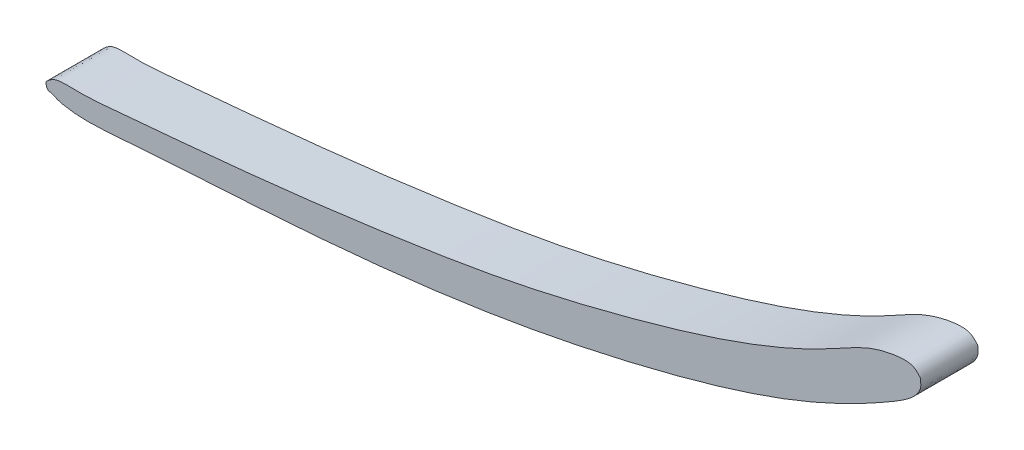
ISO-10303-21;
HEADER;
FILE_DESCRIPTION(('STEP AP214'),'2;1');
FILE_NAME('part.step','',(''),(''),'','','');
FILE_SCHEMA(('AUTOMOTIVE_DESIGN { 1 0 10303 214 1 1 1 1 }'));
ENDSEC;
DATA;
#1=APPLICATION_CONTEXT('core data for automotive mechanical design processes');
#2=APPLICATION_PROTOCOL_DEFINITION('international standard','automotive_design',2000,#1);
#3=PRODUCT_CONTEXT('',#1,'mechanical');
#4=PRODUCT('Part','Part','',(#3));
#5=PRODUCT_RELATED_PRODUCT_CATEGORY('part','',(#4));
#6=PRODUCT_DEFINITION_FORMATION('','',#4);
#7=PRODUCT_DEFINITION_CONTEXT('part definition',#1,'design');
#8=PRODUCT_DEFINITION('design','',#6,#7);
#9=PRODUCT_DEFINITION_SHAPE('','',#8);
#10=(LENGTH_UNIT() NAMED_UNIT(*) SI_UNIT(.MILLI.,.METRE.));
#11=(NAMED_UNIT(*) PLANE_ANGLE_UNIT() SI_UNIT($,.RADIAN.));
#12=(NAMED_UNIT(*) SI_UNIT($,.STERADIAN.) SOLID_ANGLE_UNIT());
#13=UNCERTAINTY_MEASURE_WITH_UNIT(LENGTH_MEASURE(1.E-05),#10,'distance_accuracy_value','');
#14=(GEOMETRIC_REPRESENTATION_CONTEXT(3) GLOBAL_UNCERTAINTY_ASSIGNED_CONTEXT((#13)) GLOBAL_UNIT_ASSIGNED_CONTEXT((#10,
#11,#12)) REPRESENTATION_CONTEXT('',''));
#15=CARTESIAN_POINT('',(0.,0.,0.));
#16=DIRECTION('',(0.,0.,1.));
#17=DIRECTION('',(1.,0.,0.));
#18=AXIS2_PLACEMENT_3D('',#15,#16,#17);
#19=CARTESIAN_POINT('',(69.8402019402488,0.,372.));
#20=CARTESIAN_POINT('',(69.8131183352634,0.080300507294765,372.));
#21=CARTESIAN_POINT('',(69.7587712007698,0.14502753566454,372.));
#22=CARTESIAN_POINT('',(69.6449684973582,0.267430118705679,372.));
#23=CARTESIAN_POINT('',(69.5845235550118,0.325095734601161,372.));
#24=CARTESIAN_POINT('',(69.4063527747583,0.501249561812645,372.));
#25=CARTESIAN_POINT('',(69.2884288249774,0.620944340683543,372.));
#26=CARTESIAN_POINT('',(69.0947803116933,0.777337881780583,372.));
#27=CARTESIAN_POINT('',(69.0279412314339,0.826034623100665,372.));
#28=CARTESIAN_POINT('',(68.885839439879,0.910792382153095,372.));
#29=CARTESIAN_POINT('',(68.8103310942326,0.947178860380819,372.));
#30=CARTESIAN_POINT('',(68.5754634481099,1.03931851645052,372.));
#31=CARTESIAN_POINT('',(68.4137254922421,1.0763337319631,372.));
#32=CARTESIAN_POINT('',(68.0851713294996,1.12633747270834,372.));
#33=CARTESIAN_POINT('',(67.9176648473177,1.13875837223819,372.));
#34=CARTESIAN_POINT('',(67.5855664422203,1.15038051347045,372.));
#35=CARTESIAN_POINT('',(67.4201268456446,1.14951689845259,372.));
#36=CARTESIAN_POINT('',(66.925437556886,1.12908435370032,372.));
#37=CARTESIAN_POINT('',(66.5977148238355,1.09279647330412,372.));
#38=CARTESIAN_POINT('',(65.6174580354396,0.952055271191534,372.));
#39=CARTESIAN_POINT('',(64.9665298261054,0.810778749377814,372.));
#40=CARTESIAN_POINT('',(63.699457151331,0.461916100979802,372.));
#41=CARTESIAN_POINT('',(63.0801898363106,0.251491643541852,372.));
#42=CARTESIAN_POINT('',(61.2643318804688,-0.485584043304456,372.));
#43=CARTESIAN_POINT('',(60.1061225212202,-1.11002705511773,372.));
#44=CARTESIAN_POINT('',(58.3777042398735,-2.06569067964736,372.));
#45=CARTESIAN_POINT('',(57.8027236866978,-2.38671390611819,372.));
#46=CARTESIAN_POINT('',(56.6465632189909,-3.01555420296361,372.));
#47=CARTESIAN_POINT('',(56.0660498147357,-3.32479110325924,372.));
#48=CARTESIAN_POINT('',(54.3109499964716,-4.22361652765636,372.));
#49=CARTESIAN_POINT('',(53.1224624814394,-4.78359230626769,372.));
#50=CARTESIAN_POINT('',(50.7204533074126,-5.85021501331587,372.));
#51=CARTESIAN_POINT('',(49.5071554857498,-6.35733877002181,372.));
#52=CARTESIAN_POINT('',(47.0624323073827,-7.33297019966831,372.));
#53=CARTESIAN_POINT('',(45.8303270261746,-7.80104830723811,372.));
#54=CARTESIAN_POINT('',(43.3527483815004,-8.69506402833173,372.));
#55=CARTESIAN_POINT('',(42.1068920479179,-9.12184143594133,372.));
#56=CARTESIAN_POINT('',(38.3525823638613,-10.3542507683054,372.));
#57=CARTESIAN_POINT('',(35.8301037057006,-11.1135759368345,372.));
#58=CARTESIAN_POINT('',(30.765716943693,-12.5585936633915,372.));
#59=CARTESIAN_POINT('',(28.2222435592048,-13.242517485026,372.));
#60=CARTESIAN_POINT('',(23.1173331987262,-14.5437801990008,372.));
#61=CARTESIAN_POINT('',(20.5575517741789,-15.1624264258865,372.));
#62=CARTESIAN_POINT('',(15.4185431667218,-16.3148220232327,372.));
#63=CARTESIAN_POINT('',(12.8379246034658,-16.8463987211125,372.));
#64=CARTESIAN_POINT('',(7.66005496765677,-17.8157610037317,372.));
#65=CARTESIAN_POINT('',(5.06336245636554,-18.2545124644928,372.));
#66=CARTESIAN_POINT('',(-0.139768865674681,-19.0743120973813,372.));
#67=CARTESIAN_POINT('',(-2.74617442692079,-19.456570614809,372.));
#68=CARTESIAN_POINT('',(-7.96301664283356,-20.1875345590055,372.));
#69=CARTESIAN_POINT('',(-10.5737379218002,-20.5358511703173,372.));
#70=CARTESIAN_POINT('',(-15.8006700814905,-21.1915174412162,372.));
#71=CARTESIAN_POINT('',(-18.4170916613073,-21.4970035664799,372.));
#72=CARTESIAN_POINT('',(-26.2724631411925,-22.3504742852798,372.));
#73=CARTESIAN_POINT('',(-31.5179520251604,-22.8392374694309,372.));
#74=CARTESIAN_POINT('',(-38.0752638111358,-23.4426019499776,372.));
#75=CARTESIAN_POINT('',(-39.3868088752837,-23.5623902665889,372.));
#76=CARTESIAN_POINT('',(-41.3545838944534,-23.73695713087,372.));
#77=CARTESIAN_POINT('',(-42.0106363500186,-23.7936758044754,372.));
#78=CARTESIAN_POINT('',(-43.3228017707354,-23.9064151000562,372.));
#79=CARTESIAN_POINT('',(-43.9788106514718,-23.9642402405613,372.));
#80=CARTESIAN_POINT('',(-45.2915385203457,-24.0682501968463,372.));
#81=CARTESIAN_POINT('',(-45.9482055429126,-24.1149922359368,372.));
#82=CARTESIAN_POINT('',(-47.2639169864788,-24.1671942518511,372.));
#83=CARTESIAN_POINT('',(-47.9231097510304,-24.1740214328811,372.));
#84=CARTESIAN_POINT('',(-48.911193653579,-24.1518494658561,372.));
#85=CARTESIAN_POINT('',(-49.2405322625955,-24.1406405673868,372.));
#86=CARTESIAN_POINT('',(-49.8993579363798,-24.1432026873211,372.));
#87=CARTESIAN_POINT('',(-50.2295908744075,-24.154110435112,372.));
#88=CARTESIAN_POINT('',(-50.8820139368018,-24.2383285267346,372.));
#89=CARTESIAN_POINT('',(-51.2062956798879,-24.3159306125897,372.));
#90=CARTESIAN_POINT('',(-51.6414534292673,-24.5388968970601,372.));
#91=CARTESIAN_POINT('',(-51.7799037771146,-24.6306236140924,372.));
#92=CARTESIAN_POINT('',(-51.9799905011985,-24.7768300271365,372.));
#93=CARTESIAN_POINT('',(-52.0451299301477,-24.8276274551133,372.));
#94=CARTESIAN_POINT('',(-52.1736630105728,-24.9315355378493,372.));
#95=CARTESIAN_POINT('',(-52.2396193353514,-24.9816911542746,372.));
#96=CARTESIAN_POINT('',(-52.3296853753061,-25.0667639562038,372.));
#97=CARTESIAN_POINT('',(-52.3578283731268,-25.0978198227402,372.));
#98=CARTESIAN_POINT('',(-52.4021530886467,-25.1667885442898,372.));
#99=CARTESIAN_POINT('',(-52.4187253518606,-25.2055027435144,372.));
#100=CARTESIAN_POINT('',(-52.4510235093626,-25.324644729202,372.));
#101=CARTESIAN_POINT('',(-52.447884634295,-25.4090863254408,372.));
#102=CARTESIAN_POINT('',(-52.4240087835658,-25.530102004863,372.));
#103=CARTESIAN_POINT('',(-52.413546911168,-25.5700760884489,372.));
#104=CARTESIAN_POINT('',(-52.3930659694707,-25.6498269760946,372.));
#105=CARTESIAN_POINT('',(-52.3829964252059,-25.6897610307274,372.));
#106=CARTESIAN_POINT('',(-52.3486458921998,-25.8081429350008,372.));
#107=CARTESIAN_POINT('',(-52.3215806277977,-25.8865812588097,372.));
#108=CARTESIAN_POINT('',(-52.2495180146907,-25.990494912569,372.));
#109=CARTESIAN_POINT('',(-52.2210913473094,-26.0211756240109,372.));
#110=CARTESIAN_POINT('',(-52.152489740778,-26.0712194628641,372.));
#111=CARTESIAN_POINT('',(-52.1150314450859,-26.0898211789263,372.));
#112=CARTESIAN_POINT('',(-51.9981447267867,-26.1364523149267,372.));
#113=CARTESIAN_POINT('',(-51.915111938896,-26.1549932060413,372.));
#114=CARTESIAN_POINT('',(-51.6719180110431,-26.2245497753252,372.));
#115=CARTESIAN_POINT('',(-51.5160063509078,-26.2909312526393,372.));
#116=CARTESIAN_POINT('',(-51.2036600658016,-26.4204933929851,372.));
#117=CARTESIAN_POINT('',(-51.047629714395,-26.485677059197,372.));
#118=CARTESIAN_POINT('',(-50.7295513330745,-26.5990776987286,372.));
#119=CARTESIAN_POINT('',(-50.5677226760638,-26.6479131884204,372.));
#120=CARTESIAN_POINT('',(-50.0762555548555,-26.7775559553132,372.));
#121=CARTESIAN_POINT('',(-49.7446150835881,-26.8416383793035,372.));
#122=CARTESIAN_POINT('',(-48.7503259548034,-27.0019394730627,372.));
#123=CARTESIAN_POINT('',(-48.0838100295354,-27.06158219846,372.));
#124=CARTESIAN_POINT('',(-46.7452101481155,-27.1089551683538,372.));
#125=CARTESIAN_POINT('',(-46.0728741226985,-27.0983424292826,372.));
#126=CARTESIAN_POINT('',(-44.727712795404,-27.0492937253493,372.));
#127=CARTESIAN_POINT('',(-44.0560842297511,-27.009665138969,372.));
#128=CARTESIAN_POINT('',(-42.7135081655366,-26.9196034092638,372.));
#129=CARTESIAN_POINT('',(-42.0425270111156,-26.8697041878575,372.));
#130=CARTESIAN_POINT('',(-40.0297721072127,-26.7170151878833,372.));
#131=CARTESIAN_POINT('',(-38.6879140632857,-26.6154772782522,372.));
#132=CARTESIAN_POINT('',(-34.6608707490514,-26.3323852606477,372.));
#133=CARTESIAN_POINT('',(-31.9744422180334,-26.1689376297405,372.));
#134=CARTESIAN_POINT('',(-26.6013311774076,-25.8458070128437,372.));
#135=CARTESIAN_POINT('',(-23.9149016801755,-25.6823897521334,372.));
#136=CARTESIAN_POINT('',(-18.5445964647633,-25.3180265743581,372.));
#137=CARTESIAN_POINT('',(-15.8605953389578,-25.1186983259998,372.));
#138=CARTESIAN_POINT('',(-10.4963970269348,-24.6650471858788,372.));
#139=CARTESIAN_POINT('',(-7.81728173968948,-24.4112920370014,372.));
#140=CARTESIAN_POINT('',(-2.46592570597572,-23.8417386327325,372.));
#141=CARTESIAN_POINT('',(0.206175072227283,-23.5246771560897,372.));
#142=CARTESIAN_POINT('',(5.54236516760205,-22.8182503288115,372.));
#143=CARTESIAN_POINT('',(8.20632993560297,-22.4291919592873,372.));
#144=CARTESIAN_POINT('',(13.5177598929493,-21.5666546679563,372.));
#145=CARTESIAN_POINT('',(16.1661107492414,-21.0937088683825,372.));
#146=CARTESIAN_POINT('',(21.4480940565549,-20.0645186478921,372.));
#147=CARTESIAN_POINT('',(24.0823644014661,-19.5080989791813,372.));
#148=CARTESIAN_POINT('',(29.3326227369891,-18.3191204480519,372.));
#149=CARTESIAN_POINT('',(31.9494412793529,-17.685802147735,372.));
#150=CARTESIAN_POINT('',(37.1599370089087,-16.3349579722053,372.));
#151=CARTESIAN_POINT('',(39.7533249942604,-15.6177129516509,372.));
#152=CARTESIAN_POINT('',(44.9054062956812,-14.0608748857915,372.));
#153=CARTESIAN_POINT('',(47.4651678115336,-13.2209291792075,372.));
#154=CARTESIAN_POINT('',(52.5136374524997,-11.3573095555039,372.));
#155=CARTESIAN_POINT('',(55.0056033621111,-10.3306348557027,372.));
#156=CARTESIAN_POINT('',(59.8873854609712,-8.06098425834151,372.));
#157=CARTESIAN_POINT('',(62.2788506940096,-6.81731507055602,372.));
#158=CARTESIAN_POINT('',(65.2098232422236,-5.16204542117804,372.));
#159=CARTESIAN_POINT('',(65.7934119812579,-4.82598129471765,372.));
#160=CARTESIAN_POINT('',(66.6575410335251,-4.30360562560369,372.));
#161=CARTESIAN_POINT('',(66.9432968359591,-4.12584278691391,372.));
#162=CARTESIAN_POINT('',(67.506449396512,-3.75702277970958,372.));
#163=CARTESIAN_POINT('',(67.7846696662486,-3.56639257817494,372.));
#164=CARTESIAN_POINT('',(68.3208293281332,-3.16278690060663,372.));
#165=CARTESIAN_POINT('',(68.578929880837,-2.94943343556422,372.));
#166=CARTESIAN_POINT('',(69.0609309634175,-2.48314130981117,372.));
#167=CARTESIAN_POINT('',(69.2858186324726,-2.22599134991544,372.));
#168=CARTESIAN_POINT('',(69.5673479713734,-1.80581731255984,372.));
#169=CARTESIAN_POINT('',(69.6528583031837,-1.66011621512446,372.));
#170=CARTESIAN_POINT('',(69.7932910116592,-1.34986940220384,372.));
#171=CARTESIAN_POINT('',(69.8465669804037,-1.19042625663442,372.));
#172=CARTESIAN_POINT('',(69.8931160961482,-0.856239455606819,372.));
#173=CARTESIAN_POINT('',(69.8814829828615,-0.682635224578085,372.));
#174=CARTESIAN_POINT('',(69.8662400925738,-0.426635516309508,372.));
#175=CARTESIAN_POINT('',(69.8647291434248,-0.341129431465914,372.));
#176=CARTESIAN_POINT('',(69.8644848831091,-0.212772397470078,372.));
#177=CARTESIAN_POINT('',(69.8648048805396,-0.169967284109232,372.));
#178=CARTESIAN_POINT('',(69.859865027392,-0.0846272159079974,372.));
#179=CARTESIAN_POINT('',(69.8537437427416,-0.0401502536473772,372.));
#180=CARTESIAN_POINT('',(69.8402019402488,0.,372.));
#181=B_SPLINE_CURVE_WITH_KNOTS('',3,(#19,#20,#21,#22,#23,#24,#25,#26,#27,#28,#29,#30,#31,#32,
#33,#34,#35,#36,#37,#38,#39,#40,#41,#42,#43,#44,#45,#46,#47,#48,#49,#50,#51,#52,#53,#54,#55,#56,
#57,#58,#59,#60,#61,#62,#63,#64,#65,#66,#67,#68,#69,#70,#71,#72,#73,#74,#75,#76,#77,#78,#79,#80,
#81,#82,#83,#84,#85,#86,#87,#88,#89,#90,#91,#92,#93,#94,#95,#96,#97,#98,#99,#100,#101,#102,#103,
#104,#105,#106,#107,#108,#109,#110,#111,#112,#113,#114,#115,#116,#117,#118,#119,#120,#121,#122,
#123,#124,#125,#126,#127,#128,#129,#130,#131,#132,#133,#134,#135,#136,#137,#138,#139,#140,#141,
#142,#143,#144,#145,#146,#147,#148,#149,#150,#151,#152,#153,#154,#155,#156,#157,#158,#159,#160,
#161,#162,#163,#164,#165,#166,#167,#168,#169,#170,#171,#172,#173,#174,#175,#176,#177,#178,#179,
#180),.UNSPECIFIED.,.T.,.F.,(4,2,2,2,2,2,2,2,2,2,2,2,2,2,2,2,2,2,2,2,2,2,2,2,2,2,2,2,2,2,2,2,2,
2,2,2,2,2,2,2,2,2,2,2,2,2,2,2,2,2,2,2,2,2,2,2,2,2,2,2,2,2,2,2,2,2,2,2,2,2,2,2,2,2,2,2,2,2,2,2,
4),(0.,0.000976562500000015,0.00195312500000003,0.00390625000000018,0.00488281250000025,
0.00585937500000032,0.00781250000000032,0.00976562500000031,0.0117187500000003,
0.0156250000000001,0.0234374999999998,0.0312499999999995,0.0468749999999988,0.0546874999999985,
0.0624999999999982,0.0781249999999975,0.0937499999999968,0.109374999999996,0.124999999999996,
0.156249999999994,0.187499999999993,0.218749999999991,0.24999999999999,0.281249999999988,
0.312499999999987,0.343749999999985,0.374999999999984,0.437499999999981,0.45312499999998,
0.46093749999998,0.46874999999998,0.476562499999979,0.484374999999979,0.488281249999979,
0.492187499999979,0.496093749999978,0.498046874999978,0.499023437499978,0.499999999999978,
0.500488281249978,0.500976562499978,0.501953124999978,0.502441406249978,0.502929687499978,
0.503906249999978,0.504394531249978,0.504882812499978,0.505859374999978,0.507812499999979,
0.509765624999979,0.511718749999979,0.515624999999979,0.523437499999979,0.53124999999998,
0.53906249999998,0.54687499999998,0.562499999999981,0.593749999999982,0.624999999999984,
0.656249999999985,0.687499999999987,0.718749999999988,0.749999999999989,0.781249999999991,
0.812499999999992,0.843749999999993,0.874999999999995,0.906249999999996,0.937499999999998,
0.968749999999999,0.976562499999999,0.980468749999999,0.984375,0.98828125,0.9921875,0.994140625,
0.99609375,0.998046875,0.9990234375,0.99951171875,1.),.UNSPECIFIED.);
#182=DIRECTION('',(0.,0.,-1.));
#183=VECTOR('',#182,1.);
#184=SURFACE_OF_LINEAR_EXTRUSION('',#181,#183);
#185=CARTESIAN_POINT('',(69.8402019402488,0.,372.));
#186=CARTESIAN_POINT('',(69.8537437427416,-0.0401502536473772,372.));
#187=CARTESIAN_POINT('',(69.859865027392,-0.0846272159079974,372.));
#188=CARTESIAN_POINT('',(69.8648048805396,-0.169967284109232,372.));
#189=CARTESIAN_POINT('',(69.8644848831091,-0.212772397470078,372.));
#190=CARTESIAN_POINT('',(69.8647291434248,-0.341129431465914,372.));
#191=CARTESIAN_POINT('',(69.8662400925738,-0.426635516309508,372.));
#192=CARTESIAN_POINT('',(69.8814829828615,-0.682635224578085,372.));
#193=CARTESIAN_POINT('',(69.8931160961482,-0.856239455606819,372.));
#194=CARTESIAN_POINT('',(69.8465669804037,-1.19042625663442,372.));
#195=CARTESIAN_POINT('',(69.7932910116592,-1.34986940220384,372.));
#196=CARTESIAN_POINT('',(69.6528583031837,-1.66011621512446,372.));
#197=CARTESIAN_POINT('',(69.5673479713734,-1.80581731255984,372.));
#198=CARTESIAN_POINT('',(69.2858186324726,-2.22599134991544,372.));
#199=CARTESIAN_POINT('',(69.0609309634175,-2.48314130981117,372.));
#200=CARTESIAN_POINT('',(68.578929880837,-2.94943343556422,372.));
#201=CARTESIAN_POINT('',(68.3208293281332,-3.16278690060663,372.));
#202=CARTESIAN_POINT('',(67.7846696662486,-3.56639257817494,372.));
#203=CARTESIAN_POINT('',(67.506449396512,-3.75702277970958,372.));
#204=CARTESIAN_POINT('',(66.9432968359591,-4.12584278691391,372.));
#205=CARTESIAN_POINT('',(66.6575410335251,-4.30360562560369,372.));
#206=CARTESIAN_POINT('',(65.7934119812579,-4.82598129471765,372.));
#207=CARTESIAN_POINT('',(65.2098232422236,-5.16204542117804,372.));
#208=CARTESIAN_POINT('',(62.2788506940096,-6.81731507055602,372.));
#209=CARTESIAN_POINT('',(59.8873854609712,-8.06098425834151,372.));
#210=CARTESIAN_POINT('',(55.0056033621111,-10.3306348557027,372.));
#211=CARTESIAN_POINT('',(52.5136374524997,-11.3573095555039,372.));
#212=CARTESIAN_POINT('',(47.4651678115336,-13.2209291792075,372.));
#213=CARTESIAN_POINT('',(44.9054062956812,-14.0608748857915,372.));
#214=CARTESIAN_POINT('',(39.7533249942604,-15.6177129516509,372.));
#215=CARTESIAN_POINT('',(37.1599370089087,-16.3349579722053,372.));
#216=CARTESIAN_POINT('',(31.9494412793529,-17.685802147735,372.));
#217=CARTESIAN_POINT('',(29.3326227369891,-18.3191204480519,372.));
#218=CARTESIAN_POINT('',(24.0823644014661,-19.5080989791813,372.));
#219=CARTESIAN_POINT('',(21.4480940565549,-20.0645186478921,372.));
#220=CARTESIAN_POINT('',(16.1661107492414,-21.0937088683825,372.));
#221=CARTESIAN_POINT('',(13.5177598929493,-21.5666546679563,372.));
#222=CARTESIAN_POINT('',(8.20632993560297,-22.4291919592873,372.));
#223=CARTESIAN_POINT('',(5.54236516760205,-22.8182503288115,372.));
#224=CARTESIAN_POINT('',(0.206175072227283,-23.5246771560897,372.));
#225=CARTESIAN_POINT('',(-2.46592570597572,-23.8417386327325,372.));
#226=CARTESIAN_POINT('',(-7.81728173968948,-24.4112920370014,372.));
#227=CARTESIAN_POINT('',(-10.4963970269348,-24.6650471858788,372.));
#228=CARTESIAN_POINT('',(-15.8605953389578,-25.1186983259998,372.));
#229=CARTESIAN_POINT('',(-18.5445964647633,-25.3180265743581,372.));
#230=CARTESIAN_POINT('',(-23.9149016801755,-25.6823897521334,372.));
#231=CARTESIAN_POINT('',(-26.6013311774076,-25.8458070128437,372.));
#232=CARTESIAN_POINT('',(-31.9744422180334,-26.1689376297405,372.));
#233=CARTESIAN_POINT('',(-34.6608707490514,-26.3323852606477,372.));
#234=CARTESIAN_POINT('',(-38.6879140632857,-26.6154772782522,372.));
#235=CARTESIAN_POINT('',(-40.0297721072127,-26.7170151878833,372.));
#236=CARTESIAN_POINT('',(-42.0425270111156,-26.8697041878575,372.));
#237=CARTESIAN_POINT('',(-42.7135081655366,-26.9196034092638,372.));
#238=CARTESIAN_POINT('',(-44.0560842297511,-27.009665138969,372.));
#239=CARTESIAN_POINT('',(-44.727712795404,-27.0492937253493,372.));
#240=CARTESIAN_POINT('',(-46.0728741226985,-27.0983424292826,372.));
#241=CARTESIAN_POINT('',(-46.7452101481155,-27.1089551683538,372.));
#242=CARTESIAN_POINT('',(-48.0838100295354,-27.06158219846,372.));
#243=CARTESIAN_POINT('',(-48.7503259548034,-27.0019394730627,372.));
#244=CARTESIAN_POINT('',(-49.7446150835881,-26.8416383793035,372.));
#245=CARTESIAN_POINT('',(-50.0762555548555,-26.7775559553132,372.));
#246=CARTESIAN_POINT('',(-50.5677226760638,-26.6479131884204,372.));
#247=CARTESIAN_POINT('',(-50.7295513330745,-26.5990776987286,372.));
#248=CARTESIAN_POINT('',(-51.047629714395,-26.485677059197,372.));
#249=CARTESIAN_POINT('',(-51.2036600658016,-26.4204933929851,372.));
#250=CARTESIAN_POINT('',(-51.5160063509078,-26.2909312526393,372.));
#251=CARTESIAN_POINT('',(-51.6719180110431,-26.2245497753252,372.));
#252=CARTESIAN_POINT('',(-51.915111938896,-26.1549932060413,372.));
#253=CARTESIAN_POINT('',(-51.9981447267867,-26.1364523149267,372.));
#254=CARTESIAN_POINT('',(-52.1150314450859,-26.0898211789263,372.));
#255=CARTESIAN_POINT('',(-52.152489740778,-26.0712194628641,372.));
#256=CARTESIAN_POINT('',(-52.2210913473094,-26.0211756240109,372.));
#257=CARTESIAN_POINT('',(-52.2495180146907,-25.990494912569,372.));
#258=CARTESIAN_POINT('',(-52.3215806277977,-25.8865812588097,372.));
#259=CARTESIAN_POINT('',(-52.3486458921998,-25.8081429350008,372.));
#260=CARTESIAN_POINT('',(-52.3829964252059,-25.6897610307274,372.));
#261=CARTESIAN_POINT('',(-52.3930659694707,-25.6498269760946,372.));
#262=CARTESIAN_POINT('',(-52.413546911168,-25.5700760884489,372.));
#263=CARTESIAN_POINT('',(-52.4240087835658,-25.530102004863,372.));
#264=CARTESIAN_POINT('',(-52.447884634295,-25.4090863254408,372.));
#265=CARTESIAN_POINT('',(-52.4510235093626,-25.324644729202,372.));
#266=CARTESIAN_POINT('',(-52.4187253518606,-25.2055027435144,372.));
#267=CARTESIAN_POINT('',(-52.4021530886467,-25.1667885442898,372.));
#268=CARTESIAN_POINT('',(-52.3578283731268,-25.0978198227402,372.));
#269=CARTESIAN_POINT('',(-52.3296853753061,-25.0667639562038,372.));
#270=CARTESIAN_POINT('',(-52.2396193353514,-24.9816911542746,372.));
#271=CARTESIAN_POINT('',(-52.1736630105728,-24.9315355378493,372.));
#272=CARTESIAN_POINT('',(-52.0451299301477,-24.8276274551133,372.));
#273=CARTESIAN_POINT('',(-51.9799905011985,-24.7768300271365,372.));
#274=CARTESIAN_POINT('',(-51.7799037771146,-24.6306236140924,372.));
#275=CARTESIAN_POINT('',(-51.6414534292673,-24.5388968970601,372.));
#276=CARTESIAN_POINT('',(-51.2062956798879,-24.3159306125897,372.));
#277=CARTESIAN_POINT('',(-50.8820139368018,-24.2383285267346,372.));
#278=CARTESIAN_POINT('',(-50.2295908744075,-24.154110435112,372.));
#279=CARTESIAN_POINT('',(-49.8993579363798,-24.1432026873211,372.));
#280=CARTESIAN_POINT('',(-49.2405322625955,-24.1406405673868,372.));
#281=CARTESIAN_POINT('',(-48.911193653579,-24.1518494658561,372.));
#282=CARTESIAN_POINT('',(-47.9231097510304,-24.1740214328811,372.));
#283=CARTESIAN_POINT('',(-47.2639169864788,-24.1671942518511,372.));
#284=CARTESIAN_POINT('',(-45.9482055429126,-24.1149922359368,372.));
#285=CARTESIAN_POINT('',(-45.2915385203457,-24.0682501968463,372.));
#286=CARTESIAN_POINT('',(-43.9788106514718,-23.9642402405613,372.));
#287=CARTESIAN_POINT('',(-43.3228017707354,-23.9064151000562,372.));
#288=CARTESIAN_POINT('',(-42.0106363500186,-23.7936758044754,372.));
#289=CARTESIAN_POINT('',(-41.3545838944534,-23.73695713087,372.));
#290=CARTESIAN_POINT('',(-39.3868088752837,-23.5623902665889,372.));
#291=CARTESIAN_POINT('',(-38.0752638111358,-23.4426019499776,372.));
#292=CARTESIAN_POINT('',(-31.5179520251604,-22.8392374694309,372.));
#293=CARTESIAN_POINT('',(-26.2724631411925,-22.3504742852798,372.));
#294=CARTESIAN_POINT('',(-18.4170916613073,-21.4970035664799,372.));
#295=CARTESIAN_POINT('',(-15.8006700814905,-21.1915174412162,372.));
#296=CARTESIAN_POINT('',(-10.5737379218002,-20.5358511703173,372.));
#297=CARTESIAN_POINT('',(-7.96301664283356,-20.1875345590055,372.));
#298=CARTESIAN_POINT('',(-2.74617442692079,-19.456570614809,372.));
#299=CARTESIAN_POINT('',(-0.139768865674681,-19.0743120973813,372.));
#300=CARTESIAN_POINT('',(5.06336245636554,-18.2545124644928,372.));
#301=CARTESIAN_POINT('',(7.66005496765677,-17.8157610037317,372.));
#302=CARTESIAN_POINT('',(12.8379246034658,-16.8463987211125,372.));
#303=CARTESIAN_POINT('',(15.4185431667218,-16.3148220232327,372.));
#304=CARTESIAN_POINT('',(20.5575517741789,-15.1624264258865,372.));
#305=CARTESIAN_POINT('',(23.1173331987262,-14.5437801990008,372.));
#306=CARTESIAN_POINT('',(28.2222435592048,-13.242517485026,372.));
#307=CARTESIAN_POINT('',(30.765716943693,-12.5585936633915,372.));
#308=CARTESIAN_POINT('',(35.8301037057006,-11.1135759368345,372.));
#309=CARTESIAN_POINT('',(38.3525823638613,-10.3542507683054,372.));
#310=CARTESIAN_POINT('',(42.1068920479179,-9.12184143594133,372.));
#311=CARTESIAN_POINT('',(43.3527483815004,-8.69506402833173,372.));
#312=CARTESIAN_POINT('',(45.8303270261746,-7.80104830723811,372.));
#313=CARTESIAN_POINT('',(47.0624323073827,-7.33297019966831,372.));
#314=CARTESIAN_POINT('',(49.5071554857498,-6.35733877002181,372.));
#315=CARTESIAN_POINT('',(50.7204533074126,-5.85021501331587,372.));
#316=CARTESIAN_POINT('',(53.1224624814394,-4.78359230626769,372.));
#317=CARTESIAN_POINT('',(54.3109499964716,-4.22361652765636,372.));
#318=CARTESIAN_POINT('',(56.0660498147357,-3.32479110325924,372.));
#319=CARTESIAN_POINT('',(56.6465632189909,-3.01555420296361,372.));
#320=CARTESIAN_POINT('',(57.8027236866978,-2.38671390611819,372.));
#321=CARTESIAN_POINT('',(58.3777042398735,-2.06569067964736,372.));
#322=CARTESIAN_POINT('',(60.1061225212202,-1.11002705511773,372.));
#323=CARTESIAN_POINT('',(61.2643318804688,-0.485584043304456,372.));
#324=CARTESIAN_POINT('',(63.0801898363106,0.251491643541852,372.));
#325=CARTESIAN_POINT('',(63.699457151331,0.461916100979802,372.));
#326=CARTESIAN_POINT('',(64.9665298261054,0.810778749377814,372.));
#327=CARTESIAN_POINT('',(65.6174580354396,0.952055271191534,372.));
#328=CARTESIAN_POINT('',(66.5977148238355,1.09279647330412,372.));
#329=CARTESIAN_POINT('',(66.925437556886,1.12908435370032,372.));
#330=CARTESIAN_POINT('',(67.4201268456446,1.14951689845259,372.));
#331=CARTESIAN_POINT('',(67.5855664422203,1.15038051347045,372.));
#332=CARTESIAN_POINT('',(67.9176648473177,1.13875837223819,372.));
#333=CARTESIAN_POINT('',(68.0851713294996,1.12633747270834,372.));
#334=CARTESIAN_POINT('',(68.4137254922421,1.0763337319631,372.));
#335=CARTESIAN_POINT('',(68.5754634481099,1.03931851645052,372.));
#336=CARTESIAN_POINT('',(68.8103310942326,0.947178860380819,372.));
#337=CARTESIAN_POINT('',(68.885839439879,0.910792382153095,372.));
#338=CARTESIAN_POINT('',(69.0279412314339,0.826034623100665,372.));
#339=CARTESIAN_POINT('',(69.0947803116933,0.777337881780583,372.));
#340=CARTESIAN_POINT('',(69.2884288249774,0.620944340683543,372.));
#341=CARTESIAN_POINT('',(69.4063527747583,0.501249561812645,372.));
#342=CARTESIAN_POINT('',(69.5845235550118,0.325095734601161,372.));
#343=CARTESIAN_POINT('',(69.6449684973582,0.267430118705679,372.));
#344=CARTESIAN_POINT('',(69.7587712007698,0.14502753566454,372.));
#345=CARTESIAN_POINT('',(69.8131183352634,0.080300507294765,372.));
#346=CARTESIAN_POINT('',(69.8402019402488,0.,372.));
#347=B_SPLINE_CURVE_WITH_KNOTS('',3,(#185,#186,#187,#188,#189,#190,#191,#192,#193,#194,#195,
#196,#197,#198,#199,#200,#201,#202,#203,#204,#205,#206,#207,#208,#209,#210,#211,#212,#213,#214,
#215,#216,#217,#218,#219,#220,#221,#222,#223,#224,#225,#226,#227,#228,#229,#230,#231,#232,#233,
#234,#235,#236,#237,#238,#239,#240,#241,#242,#243,#244,#245,#246,#247,#248,#249,#250,#251,#252,
#253,#254,#255,#256,#257,#258,#259,#260,#261,#262,#263,#264,#265,#266,#267,#268,#269,#270,#271,
#272,#273,#274,#275,#276,#277,#278,#279,#280,#281,#282,#283,#284,#285,#286,#287,#288,#289,#290,
#291,#292,#293,#294,#295,#296,#297,#298,#299,#300,#301,#302,#303,#304,#305,#306,#307,#308,#309,
#310,#311,#312,#313,#314,#315,#316,#317,#318,#319,#320,#321,#322,#323,#324,#325,#326,#327,#328,
#329,#330,#331,#332,#333,#334,#335,#336,#337,#338,#339,#340,#341,#342,#343,#344,#345,#346),
.UNSPECIFIED.,.T.,.F.,(4,2,2,2,2,2,2,2,2,2,2,2,2,2,2,2,2,2,2,2,2,2,2,2,2,2,2,2,2,2,2,2,2,2,2,2,
2,2,2,2,2,2,2,2,2,2,2,2,2,2,2,2,2,2,2,2,2,2,2,2,2,2,2,2,2,2,2,2,2,2,2,2,2,2,2,2,2,2,2,2,4),(0.,
0.00048828125,0.0009765625,0.001953125,0.00390625000000011,0.00585937500000011,
0.00781250000000011,0.0117187500000003,0.0156250000000004,0.0195312500000007,0.0234375000000008,
0.031250000000001,0.0625000000000024,0.0937500000000038,0.125000000000005,0.156250000000007,
0.187500000000008,0.218750000000009,0.250000000000011,0.281250000000012,0.312500000000013,
0.343750000000015,0.375000000000016,0.406250000000018,0.437500000000019,0.45312500000002,
0.46093750000002,0.46875000000002,0.476562500000021,0.484375000000021,0.488281250000021,
0.490234375000021,0.492187500000021,0.494140625000022,0.495117187500022,0.495605468750022,
0.496093750000022,0.497070312500022,0.497558593750022,0.498046875000022,0.499023437500022,
0.499511718750022,0.500000000000022,0.500976562500022,0.501953125000022,0.503906250000022,
0.507812500000022,0.511718750000021,0.515625000000021,0.523437500000021,0.53125000000002,
0.53906250000002,0.54687500000002,0.562500000000019,0.625000000000016,0.656250000000015,
0.687500000000013,0.718750000000012,0.75000000000001,0.781250000000009,0.812500000000007,
0.843750000000006,0.875000000000004,0.890625000000004,0.906250000000003,0.921875000000002,
0.937500000000002,0.945312500000001,0.953125000000001,0.968750000000001,0.9765625,0.984375,
0.98828125,0.990234375,0.9921875,0.994140625,0.9951171875,0.99609375,0.998046875,0.9990234375,
1.),.UNSPECIFIED.);
#348=CARTESIAN_POINT('',(69.8402019402488,0.,372.));
#349=VERTEX_POINT('',#348);
#350=EDGE_CURVE('E10',#349,#349,#347,.F.);
#351=ORIENTED_EDGE('',*,*,#350,.F.);
#352=EDGE_LOOP('',(#351));
#353=FACE_BOUND('',#352,.T.);
#354=CARTESIAN_POINT('',(69.8402019402488,0.,364.));
#355=CARTESIAN_POINT('',(69.8131183352634,0.080300507294765,364.));
#356=CARTESIAN_POINT('',(69.7587712007698,0.14502753566454,364.));
#357=CARTESIAN_POINT('',(69.6449684973582,0.267430118705679,364.));
#358=CARTESIAN_POINT('',(69.5845235550118,0.325095734601161,364.));
#359=CARTESIAN_POINT('',(69.4063527747583,0.501249561812645,364.));
#360=CARTESIAN_POINT('',(69.2884288249774,0.620944340683543,364.));
#361=CARTESIAN_POINT('',(69.0947803116933,0.777337881780583,364.));
#362=CARTESIAN_POINT('',(69.0279412314339,0.826034623100665,364.));
#363=CARTESIAN_POINT('',(68.885839439879,0.910792382153095,364.));
#364=CARTESIAN_POINT('',(68.8103310942326,0.947178860380819,364.));
#365=CARTESIAN_POINT('',(68.5754634481099,1.03931851645052,364.));
#366=CARTESIAN_POINT('',(68.4137254922421,1.0763337319631,364.));
#367=CARTESIAN_POINT('',(68.0851713294996,1.12633747270834,364.));
#368=CARTESIAN_POINT('',(67.9176648473177,1.13875837223819,364.));
#369=CARTESIAN_POINT('',(67.5855664422203,1.15038051347045,364.));
#370=CARTESIAN_POINT('',(67.4201268456446,1.14951689845259,364.));
#371=CARTESIAN_POINT('',(66.925437556886,1.12908435370032,364.));
#372=CARTESIAN_POINT('',(66.5977148238355,1.09279647330412,364.));
#373=CARTESIAN_POINT('',(65.6174580354396,0.952055271191534,364.));
#374=CARTESIAN_POINT('',(64.9665298261054,0.810778749377814,364.));
#375=CARTESIAN_POINT('',(63.699457151331,0.461916100979802,364.));
#376=CARTESIAN_POINT('',(63.0801898363106,0.251491643541852,364.));
#377=CARTESIAN_POINT('',(61.2643318804688,-0.485584043304456,364.));
#378=CARTESIAN_POINT('',(60.1061225212202,-1.11002705511773,364.));
#379=CARTESIAN_POINT('',(58.3777042398735,-2.06569067964736,364.));
#380=CARTESIAN_POINT('',(57.8027236866978,-2.38671390611819,364.));
#381=CARTESIAN_POINT('',(56.6465632189909,-3.01555420296361,364.));
#382=CARTESIAN_POINT('',(56.0660498147357,-3.32479110325924,364.));
#383=CARTESIAN_POINT('',(54.3109499964716,-4.22361652765636,364.));
#384=CARTESIAN_POINT('',(53.1224624814394,-4.78359230626769,364.));
#385=CARTESIAN_POINT('',(50.7204533074126,-5.85021501331587,364.));
#386=CARTESIAN_POINT('',(49.5071554857498,-6.35733877002181,364.));
#387=CARTESIAN_POINT('',(47.0624323073827,-7.33297019966831,364.));
#388=CARTESIAN_POINT('',(45.8303270261746,-7.80104830723811,364.));
#389=CARTESIAN_POINT('',(43.3527483815004,-8.69506402833173,364.));
#390=CARTESIAN_POINT('',(42.1068920479179,-9.12184143594133,364.));
#391=CARTESIAN_POINT('',(38.3525823638613,-10.3542507683054,364.));
#392=CARTESIAN_POINT('',(35.8301037057006,-11.1135759368345,364.));
#393=CARTESIAN_POINT('',(30.765716943693,-12.5585936633915,364.));
#394=CARTESIAN_POINT('',(28.2222435592048,-13.242517485026,364.));
#395=CARTESIAN_POINT('',(23.1173331987262,-14.5437801990008,364.));
#396=CARTESIAN_POINT('',(20.5575517741789,-15.1624264258865,364.));
#397=CARTESIAN_POINT('',(15.4185431667218,-16.3148220232327,364.));
#398=CARTESIAN_POINT('',(12.8379246034658,-16.8463987211125,364.));
#399=CARTESIAN_POINT('',(7.66005496765677,-17.8157610037317,364.));
#400=CARTESIAN_POINT('',(5.06336245636554,-18.2545124644928,364.));
#401=CARTESIAN_POINT('',(-0.139768865674681,-19.0743120973813,364.));
#402=CARTESIAN_POINT('',(-2.74617442692079,-19.456570614809,364.));
#403=CARTESIAN_POINT('',(-7.96301664283356,-20.1875345590055,364.));
#404=CARTESIAN_POINT('',(-10.5737379218002,-20.5358511703173,364.));
#405=CARTESIAN_POINT('',(-15.8006700814905,-21.1915174412162,364.));
#406=CARTESIAN_POINT('',(-18.4170916613073,-21.4970035664799,364.));
#407=CARTESIAN_POINT('',(-26.2724631411925,-22.3504742852798,364.));
#408=CARTESIAN_POINT('',(-31.5179520251604,-22.8392374694309,364.));
#409=CARTESIAN_POINT('',(-38.0752638111358,-23.4426019499776,364.));
#410=CARTESIAN_POINT('',(-39.3868088752837,-23.5623902665889,364.));
#411=CARTESIAN_POINT('',(-41.3545838944534,-23.73695713087,364.));
#412=CARTESIAN_POINT('',(-42.0106363500186,-23.7936758044754,364.));
#413=CARTESIAN_POINT('',(-43.3228017707354,-23.9064151000562,364.));
#414=CARTESIAN_POINT('',(-43.9788106514718,-23.9642402405613,364.));
#415=CARTESIAN_POINT('',(-45.2915385203457,-24.0682501968463,364.));
#416=CARTESIAN_POINT('',(-45.9482055429126,-24.1149922359368,364.));
#417=CARTESIAN_POINT('',(-47.2639169864788,-24.1671942518511,364.));
#418=CARTESIAN_POINT('',(-47.9231097510304,-24.1740214328811,364.));
#419=CARTESIAN_POINT('',(-48.911193653579,-24.1518494658561,364.));
#420=CARTESIAN_POINT('',(-49.2405322625955,-24.1406405673868,364.));
#421=CARTESIAN_POINT('',(-49.8993579363798,-24.1432026873211,364.));
#422=CARTESIAN_POINT('',(-50.2295908744075,-24.154110435112,364.));
#423=CARTESIAN_POINT('',(-50.8820139368018,-24.2383285267346,364.));
#424=CARTESIAN_POINT('',(-51.2062956798879,-24.3159306125897,364.));
#425=CARTESIAN_POINT('',(-51.6414534292673,-24.5388968970601,364.));
#426=CARTESIAN_POINT('',(-51.7799037771146,-24.6306236140924,364.));
#427=CARTESIAN_POINT('',(-51.9799905011985,-24.7768300271365,364.));
#428=CARTESIAN_POINT('',(-52.0451299301477,-24.8276274551133,364.));
#429=CARTESIAN_POINT('',(-52.1736630105728,-24.9315355378493,364.));
#430=CARTESIAN_POINT('',(-52.2396193353514,-24.9816911542746,364.));
#431=CARTESIAN_POINT('',(-52.3296853753061,-25.0667639562038,364.));
#432=CARTESIAN_POINT('',(-52.3578283731268,-25.0978198227402,364.));
#433=CARTESIAN_POINT('',(-52.4021530886467,-25.1667885442898,364.));
#434=CARTESIAN_POINT('',(-52.4187253518606,-25.2055027435144,364.));
#435=CARTESIAN_POINT('',(-52.4510235093626,-25.324644729202,364.));
#436=CARTESIAN_POINT('',(-52.447884634295,-25.4090863254408,364.));
#437=CARTESIAN_POINT('',(-52.4240087835658,-25.530102004863,364.));
#438=CARTESIAN_POINT('',(-52.413546911168,-25.5700760884489,364.));
#439=CARTESIAN_POINT('',(-52.3930659694707,-25.6498269760946,364.));
#440=CARTESIAN_POINT('',(-52.3829964252059,-25.6897610307274,364.));
#441=CARTESIAN_POINT('',(-52.3486458921998,-25.8081429350008,364.));
#442=CARTESIAN_POINT('',(-52.3215806277977,-25.8865812588097,364.));
#443=CARTESIAN_POINT('',(-52.2495180146907,-25.990494912569,364.));
#444=CARTESIAN_POINT('',(-52.2210913473094,-26.0211756240109,364.));
#445=CARTESIAN_POINT('',(-52.152489740778,-26.0712194628641,364.));
#446=CARTESIAN_POINT('',(-52.1150314450859,-26.0898211789263,364.));
#447=CARTESIAN_POINT('',(-51.9981447267867,-26.1364523149267,364.));
#448=CARTESIAN_POINT('',(-51.915111938896,-26.1549932060413,364.));
#449=CARTESIAN_POINT('',(-51.6719180110431,-26.2245497753252,364.));
#450=CARTESIAN_POINT('',(-51.5160063509078,-26.2909312526393,364.));
#451=CARTESIAN_POINT('',(-51.2036600658016,-26.4204933929851,364.));
#452=CARTESIAN_POINT('',(-51.047629714395,-26.485677059197,364.));
#453=CARTESIAN_POINT('',(-50.7295513330745,-26.5990776987286,364.));
#454=CARTESIAN_POINT('',(-50.5677226760638,-26.6479131884204,364.));
#455=CARTESIAN_POINT('',(-50.0762555548555,-26.7775559553132,364.));
#456=CARTESIAN_POINT('',(-49.7446150835881,-26.8416383793035,364.));
#457=CARTESIAN_POINT('',(-48.7503259548034,-27.0019394730627,364.));
#458=CARTESIAN_POINT('',(-48.0838100295354,-27.06158219846,364.));
#459=CARTESIAN_POINT('',(-46.7452101481155,-27.1089551683538,364.));
#460=CARTESIAN_POINT('',(-46.0728741226985,-27.0983424292826,364.));
#461=CARTESIAN_POINT('',(-44.727712795404,-27.0492937253493,364.));
#462=CARTESIAN_POINT('',(-44.0560842297511,-27.009665138969,364.));
#463=CARTESIAN_POINT('',(-42.7135081655366,-26.9196034092638,364.));
#464=CARTESIAN_POINT('',(-42.0425270111156,-26.8697041878575,364.));
#465=CARTESIAN_POINT('',(-40.0297721072127,-26.7170151878833,364.));
#466=CARTESIAN_POINT('',(-38.6879140632857,-26.6154772782522,364.));
#467=CARTESIAN_POINT('',(-34.6608707490514,-26.3323852606477,364.));
#468=CARTESIAN_POINT('',(-31.9744422180334,-26.1689376297405,364.));
#469=CARTESIAN_POINT('',(-26.6013311774076,-25.8458070128437,364.));
#470=CARTESIAN_POINT('',(-23.9149016801755,-25.6823897521334,364.));
#471=CARTESIAN_POINT('',(-18.5445964647633,-25.3180265743581,364.));
#472=CARTESIAN_POINT('',(-15.8605953389578,-25.1186983259998,364.));
#473=CARTESIAN_POINT('',(-10.4963970269348,-24.6650471858788,364.));
#474=CARTESIAN_POINT('',(-7.81728173968948,-24.4112920370014,364.));
#475=CARTESIAN_POINT('',(-2.46592570597572,-23.8417386327325,364.));
#476=CARTESIAN_POINT('',(0.206175072227283,-23.5246771560897,364.));
#477=CARTESIAN_POINT('',(5.54236516760205,-22.8182503288115,364.));
#478=CARTESIAN_POINT('',(8.20632993560297,-22.4291919592873,364.));
#479=CARTESIAN_POINT('',(13.5177598929493,-21.5666546679563,364.));
#480=CARTESIAN_POINT('',(16.1661107492414,-21.0937088683825,364.));
#481=CARTESIAN_POINT('',(21.4480940565549,-20.0645186478921,364.));
#482=CARTESIAN_POINT('',(24.0823644014661,-19.5080989791813,364.));
#483=CARTESIAN_POINT('',(29.3326227369891,-18.3191204480519,364.));
#484=CARTESIAN_POINT('',(31.9494412793529,-17.685802147735,364.));
#485=CARTESIAN_POINT('',(37.1599370089087,-16.3349579722053,364.));
#486=CARTESIAN_POINT('',(39.7533249942604,-15.6177129516509,364.));
#487=CARTESIAN_POINT('',(44.9054062956812,-14.0608748857915,364.));
#488=CARTESIAN_POINT('',(47.4651678115336,-13.2209291792075,364.));
#489=CARTESIAN_POINT('',(52.5136374524997,-11.3573095555039,364.));
#490=CARTESIAN_POINT('',(55.0056033621111,-10.3306348557027,364.));
#491=CARTESIAN_POINT('',(59.8873854609712,-8.06098425834151,364.));
#492=CARTESIAN_POINT('',(62.2788506940096,-6.81731507055602,364.));
#493=CARTESIAN_POINT('',(65.2098232422236,-5.16204542117804,364.));
#494=CARTESIAN_POINT('',(65.7934119812579,-4.82598129471765,364.));
#495=CARTESIAN_POINT('',(66.6575410335251,-4.30360562560369,364.));
#496=CARTESIAN_POINT('',(66.9432968359591,-4.12584278691391,364.));
#497=CARTESIAN_POINT('',(67.506449396512,-3.75702277970958,364.));
#498=CARTESIAN_POINT('',(67.7846696662486,-3.56639257817494,364.));
#499=CARTESIAN_POINT('',(68.3208293281332,-3.16278690060663,364.));
#500=CARTESIAN_POINT('',(68.578929880837,-2.94943343556422,364.));
#501=CARTESIAN_POINT('',(69.0609309634175,-2.48314130981117,364.));
#502=CARTESIAN_POINT('',(69.2858186324726,-2.22599134991544,364.));
#503=CARTESIAN_POINT('',(69.5673479713734,-1.80581731255984,364.));
#504=CARTESIAN_POINT('',(69.6528583031837,-1.66011621512446,364.));
#505=CARTESIAN_POINT('',(69.7932910116592,-1.34986940220384,364.));
#506=CARTESIAN_POINT('',(69.8465669804037,-1.19042625663442,364.));
#507=CARTESIAN_POINT('',(69.8931160961482,-0.856239455606819,364.));
#508=CARTESIAN_POINT('',(69.8814829828615,-0.682635224578085,364.));
#509=CARTESIAN_POINT('',(69.8662400925738,-0.426635516309508,364.));
#510=CARTESIAN_POINT('',(69.8647291434248,-0.341129431465914,364.));
#511=CARTESIAN_POINT('',(69.8644848831091,-0.212772397470078,364.));
#512=CARTESIAN_POINT('',(69.8648048805396,-0.169967284109232,364.));
#513=CARTESIAN_POINT('',(69.859865027392,-0.0846272159079974,364.));
#514=CARTESIAN_POINT('',(69.8537437427416,-0.0401502536473772,364.));
#515=CARTESIAN_POINT('',(69.8402019402488,0.,364.));
#516=B_SPLINE_CURVE_WITH_KNOTS('',3,(#354,#355,#356,#357,#358,#359,#360,#361,#362,#363,#364,
#365,#366,#367,#368,#369,#370,#371,#372,#373,#374,#375,#376,#377,#378,#379,#380,#381,#382,#383,
#384,#385,#386,#387,#388,#389,#390,#391,#392,#393,#394,#395,#396,#397,#398,#399,#400,#401,#402,
#403,#404,#405,#406,#407,#408,#409,#410,#411,#412,#413,#414,#415,#416,#417,#418,#419,#420,#421,
#422,#423,#424,#425,#426,#427,#428,#429,#430,#431,#432,#433,#434,#435,#436,#437,#438,#439,#440,
#441,#442,#443,#444,#445,#446,#447,#448,#449,#450,#451,#452,#453,#454,#455,#456,#457,#458,#459,
#460,#461,#462,#463,#464,#465,#466,#467,#468,#469,#470,#471,#472,#473,#474,#475,#476,#477,#478,
#479,#480,#481,#482,#483,#484,#485,#486,#487,#488,#489,#490,#491,#492,#493,#494,#495,#496,#497,
#498,#499,#500,#501,#502,#503,#504,#505,#506,#507,#508,#509,#510,#511,#512,#513,#514,#515),
.UNSPECIFIED.,.T.,.F.,(4,2,2,2,2,2,2,2,2,2,2,2,2,2,2,2,2,2,2,2,2,2,2,2,2,2,2,2,2,2,2,2,2,2,2,2,
2,2,2,2,2,2,2,2,2,2,2,2,2,2,2,2,2,2,2,2,2,2,2,2,2,2,2,2,2,2,2,2,2,2,2,2,2,2,2,2,2,2,2,2,4),(0.,
0.000976562500000015,0.00195312500000003,0.00390625000000018,0.00488281250000025,
0.00585937500000032,0.00781250000000032,0.00976562500000031,0.0117187500000003,
0.0156250000000001,0.0234374999999998,0.0312499999999995,0.0468749999999988,0.0546874999999985,
0.0624999999999982,0.0781249999999975,0.0937499999999968,0.109374999999996,0.124999999999996,
0.156249999999994,0.187499999999993,0.218749999999991,0.24999999999999,0.281249999999988,
0.312499999999987,0.343749999999985,0.374999999999984,0.437499999999981,0.45312499999998,
0.46093749999998,0.46874999999998,0.476562499999979,0.484374999999979,0.488281249999979,
0.492187499999979,0.496093749999978,0.498046874999978,0.499023437499978,0.499999999999978,
0.500488281249978,0.500976562499978,0.501953124999978,0.502441406249978,0.502929687499978,
0.503906249999978,0.504394531249978,0.504882812499978,0.505859374999978,0.507812499999979,
0.509765624999979,0.511718749999979,0.515624999999979,0.523437499999979,0.53124999999998,
0.53906249999998,0.54687499999998,0.562499999999981,0.593749999999982,0.624999999999984,
0.656249999999985,0.687499999999987,0.718749999999988,0.749999999999989,0.781249999999991,
0.812499999999992,0.843749999999993,0.874999999999995,0.906249999999996,0.937499999999998,
0.968749999999999,0.976562499999999,0.980468749999999,0.984375,0.98828125,0.9921875,0.994140625,
0.99609375,0.998046875,0.9990234375,0.99951171875,1.),.UNSPECIFIED.);
#517=CARTESIAN_POINT('',(69.8402019402488,0.,364.));
#518=VERTEX_POINT('',#517);
#519=EDGE_CURVE('E38',#518,#518,#516,.T.);
#520=ORIENTED_EDGE('',*,*,#519,.T.);
#521=EDGE_LOOP('',(#520));
#522=FACE_BOUND('',#521,.T.);
#523=ADVANCED_FACE('F28',(#353,#522),#184,.F.);
#524=CARTESIAN_POINT('',(-52.2996633619919,-25.0384063555645,372.));
#525=DIRECTION('',(0.,0.,-1.));
#526=DIRECTION('',(-1.,0.,0.));
#527=AXIS2_PLACEMENT_3D('',#524,#525,#526);
#528=PLANE('',#527);
#529=ORIENTED_EDGE('',*,*,#350,.T.);
#530=EDGE_LOOP('',(#529));
#531=FACE_BOUND('',#530,.T.);
#532=ADVANCED_FACE('F69',(#531),#528,.F.);
#533=CARTESIAN_POINT('',(-52.2996633619919,-25.0384063555645,364.));
#534=DIRECTION('',(0.,0.,-1.));
#535=DIRECTION('',(-1.,0.,0.));
#536=AXIS2_PLACEMENT_3D('',#533,#534,#535);
#537=PLANE('',#536);
#538=ORIENTED_EDGE('',*,*,#519,.F.);
#539=EDGE_LOOP('',(#538));
#540=FACE_BOUND('',#539,.T.);
#541=ADVANCED_FACE('F77',(#540),#537,.T.);
#542=CLOSED_SHELL('',(#523,#532,#541));
#543=MANIFOLD_SOLID_BREP('B2',#542);
#544=ADVANCED_BREP_SHAPE_REPRESENTATION('',(#18,#543),#14);
#545=SHAPE_DEFINITION_REPRESENTATION(#9,#544);
ENDSEC;
END-ISO-10303-21;
